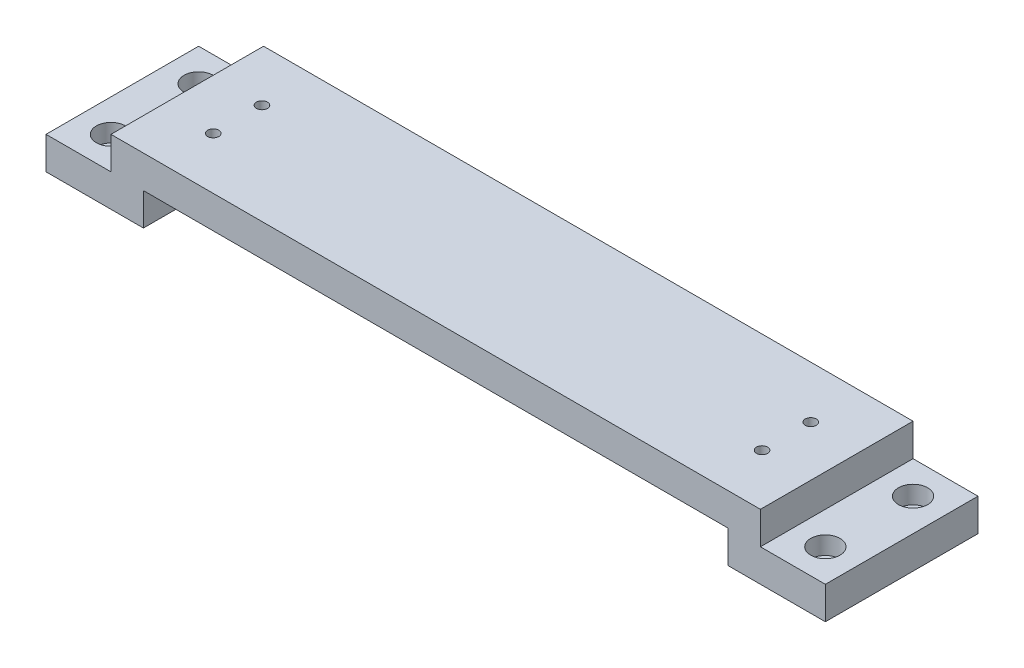
ISO-10303-21;
HEADER;
FILE_DESCRIPTION(('STEP AP214'),'2;1');
FILE_NAME('part.step','',(''),(''),'','','');
FILE_SCHEMA(('AUTOMOTIVE_DESIGN { 1 0 10303 214 1 1 1 1 }'));
ENDSEC;
DATA;
#1=APPLICATION_CONTEXT('core data for automotive mechanical design processes');
#2=APPLICATION_PROTOCOL_DEFINITION('international standard','automotive_design',2000,#1);
#3=PRODUCT_CONTEXT('',#1,'mechanical');
#4=PRODUCT('Part','Part','',(#3));
#5=PRODUCT_RELATED_PRODUCT_CATEGORY('part','',(#4));
#6=PRODUCT_DEFINITION_FORMATION('','',#4);
#7=PRODUCT_DEFINITION_CONTEXT('part definition',#1,'design');
#8=PRODUCT_DEFINITION('design','',#6,#7);
#9=PRODUCT_DEFINITION_SHAPE('','',#8);
#10=(LENGTH_UNIT() NAMED_UNIT(*) SI_UNIT(.MILLI.,.METRE.));
#11=(NAMED_UNIT(*) PLANE_ANGLE_UNIT() SI_UNIT($,.RADIAN.));
#12=(NAMED_UNIT(*) SI_UNIT($,.STERADIAN.) SOLID_ANGLE_UNIT());
#13=UNCERTAINTY_MEASURE_WITH_UNIT(LENGTH_MEASURE(1.E-05),#10,'distance_accuracy_value','');
#14=(GEOMETRIC_REPRESENTATION_CONTEXT(3) GLOBAL_UNCERTAINTY_ASSIGNED_CONTEXT((#13)) GLOBAL_UNIT_ASSIGNED_CONTEXT((#10,
#11,#12)) REPRESENTATION_CONTEXT('',''));
#15=CARTESIAN_POINT('',(0.,0.,0.));
#16=DIRECTION('',(0.,0.,1.));
#17=DIRECTION('',(1.,0.,0.));
#18=AXIS2_PLACEMENT_3D('',#15,#16,#17);
#19=CARTESIAN_POINT('',(-214.5,-11.,-27.));
#20=DIRECTION('',(0.,-1.,0.));
#21=DIRECTION('',(0.,0.,-1.));
#22=AXIS2_PLACEMENT_3D('',#19,#20,#21);
#23=PLANE('',#22);
#24=CARTESIAN_POINT('',(-220.,-11.,-27.));
#25=DIRECTION('',(0.,1.,0.));
#26=DIRECTION('',(0.,0.,1.));
#27=AXIS2_PLACEMENT_3D('',#24,#25,#26);
#28=CIRCLE('',#27,5.5);
#29=CARTESIAN_POINT('',(-220.,-11.,-21.5));
#30=VERTEX_POINT('',#29);
#31=EDGE_CURVE('E269',#30,#30,#28,.T.);
#32=ORIENTED_EDGE('',*,*,#31,.F.);
#33=EDGE_LOOP('',(#32));
#34=FACE_BOUND('',#33,.T.);
#35=CARTESIAN_POINT('',(-220.,-11.,-27.));
#36=DIRECTION('',(0.,1.,0.));
#37=DIRECTION('',(0.,0.,1.));
#38=AXIS2_PLACEMENT_3D('',#35,#36,#37);
#39=CIRCLE('',#38,9.);
#40=CARTESIAN_POINT('',(-220.,-11.,-18.));
#41=VERTEX_POINT('',#40);
#42=EDGE_CURVE('E190',#41,#41,#39,.T.);
#43=ORIENTED_EDGE('',*,*,#42,.T.);
#44=EDGE_LOOP('',(#43));
#45=FACE_BOUND('',#44,.T.);
#46=ADVANCED_FACE('F19',(#34,#45),#23,.F.);
#47=CARTESIAN_POINT('',(-214.5,-11.,27.));
#48=DIRECTION('',(0.,-1.,0.));
#49=DIRECTION('',(0.,0.,-1.));
#50=AXIS2_PLACEMENT_3D('',#47,#48,#49);
#51=PLANE('',#50);
#52=CARTESIAN_POINT('',(-220.,-11.,27.));
#53=DIRECTION('',(0.,1.,0.));
#54=DIRECTION('',(0.,0.,1.));
#55=AXIS2_PLACEMENT_3D('',#52,#53,#54);
#56=CIRCLE('',#55,5.5);
#57=CARTESIAN_POINT('',(-220.,-11.,32.5));
#58=VERTEX_POINT('',#57);
#59=EDGE_CURVE('E251',#58,#58,#56,.T.);
#60=ORIENTED_EDGE('',*,*,#59,.F.);
#61=EDGE_LOOP('',(#60));
#62=FACE_BOUND('',#61,.T.);
#63=CARTESIAN_POINT('',(-220.,-11.,27.));
#64=DIRECTION('',(0.,1.,0.));
#65=DIRECTION('',(0.,0.,1.));
#66=AXIS2_PLACEMENT_3D('',#63,#64,#65);
#67=CIRCLE('',#66,9.);
#68=CARTESIAN_POINT('',(-220.,-11.,36.));
#69=VERTEX_POINT('',#68);
#70=EDGE_CURVE('E394',#69,#69,#67,.T.);
#71=ORIENTED_EDGE('',*,*,#70,.T.);
#72=EDGE_LOOP('',(#71));
#73=FACE_BOUND('',#72,.T.);
#74=ADVANCED_FACE('F453',(#62,#73),#51,.F.);
#75=CARTESIAN_POINT('',(225.5,-11.,-27.));
#76=DIRECTION('',(0.,-1.,0.));
#77=DIRECTION('',(0.,0.,-1.));
#78=AXIS2_PLACEMENT_3D('',#75,#76,#77);
#79=PLANE('',#78);
#80=CARTESIAN_POINT('',(220.,-11.,-27.));
#81=DIRECTION('',(0.,1.,0.));
#82=DIRECTION('',(0.,0.,1.));
#83=AXIS2_PLACEMENT_3D('',#80,#81,#82);
#84=CIRCLE('',#83,5.5);
#85=CARTESIAN_POINT('',(220.,-11.,-21.5));
#86=VERTEX_POINT('',#85);
#87=EDGE_CURVE('E202',#86,#86,#84,.T.);
#88=ORIENTED_EDGE('',*,*,#87,.F.);
#89=EDGE_LOOP('',(#88));
#90=FACE_BOUND('',#89,.T.);
#91=CARTESIAN_POINT('',(220.,-11.,-27.));
#92=DIRECTION('',(0.,1.,0.));
#93=DIRECTION('',(0.,0.,1.));
#94=AXIS2_PLACEMENT_3D('',#91,#92,#93);
#95=CIRCLE('',#94,9.);
#96=CARTESIAN_POINT('',(220.,-11.,-18.));
#97=VERTEX_POINT('',#96);
#98=EDGE_CURVE('E341',#97,#97,#95,.T.);
#99=ORIENTED_EDGE('',*,*,#98,.T.);
#100=EDGE_LOOP('',(#99));
#101=FACE_BOUND('',#100,.T.);
#102=ADVANCED_FACE('F524',(#90,#101),#79,.F.);
#103=CARTESIAN_POINT('',(225.5,-11.,27.));
#104=DIRECTION('',(0.,-1.,0.));
#105=DIRECTION('',(0.,0.,-1.));
#106=AXIS2_PLACEMENT_3D('',#103,#104,#105);
#107=PLANE('',#106);
#108=CARTESIAN_POINT('',(220.,-11.,27.));
#109=DIRECTION('',(0.,1.,0.));
#110=DIRECTION('',(0.,0.,1.));
#111=AXIS2_PLACEMENT_3D('',#108,#109,#110);
#112=CIRCLE('',#111,5.5);
#113=CARTESIAN_POINT('',(220.,-11.,32.5));
#114=VERTEX_POINT('',#113);
#115=EDGE_CURVE('E291',#114,#114,#112,.T.);
#116=ORIENTED_EDGE('',*,*,#115,.F.);
#117=EDGE_LOOP('',(#116));
#118=FACE_BOUND('',#117,.T.);
#119=CARTESIAN_POINT('',(220.,-11.,27.));
#120=DIRECTION('',(0.,1.,0.));
#121=DIRECTION('',(0.,0.,1.));
#122=AXIS2_PLACEMENT_3D('',#119,#120,#121);
#123=CIRCLE('',#122,9.);
#124=CARTESIAN_POINT('',(220.,-11.,36.));
#125=VERTEX_POINT('',#124);
#126=EDGE_CURVE('E207',#125,#125,#123,.T.);
#127=ORIENTED_EDGE('',*,*,#126,.T.);
#128=EDGE_LOOP('',(#127));
#129=FACE_BOUND('',#128,.T.);
#130=ADVANCED_FACE('F525',(#118,#129),#107,.F.);
#131=CARTESIAN_POINT('',(0.,0.,0.));
#132=DIRECTION('',(0.,-1.,0.));
#133=DIRECTION('',(0.,0.,-1.));
#134=AXIS2_PLACEMENT_3D('',#131,#132,#133);
#135=PLANE('',#134);
#136=CARTESIAN_POINT('',(220.,0.,27.));
#137=DIRECTION('',(0.,1.,0.));
#138=DIRECTION('',(0.,0.,1.));
#139=AXIS2_PLACEMENT_3D('',#136,#137,#138);
#140=CIRCLE('',#139,9.);
#141=CARTESIAN_POINT('',(220.,0.,36.));
#142=VERTEX_POINT('',#141);
#143=EDGE_CURVE('E227',#142,#142,#140,.T.);
#144=ORIENTED_EDGE('',*,*,#143,.F.);
#145=EDGE_LOOP('',(#144));
#146=FACE_BOUND('',#145,.T.);
#147=CARTESIAN_POINT('',(220.,0.,-27.));
#148=DIRECTION('',(0.,1.,0.));
#149=DIRECTION('',(0.,0.,1.));
#150=AXIS2_PLACEMENT_3D('',#147,#148,#149);
#151=CIRCLE('',#150,9.);
#152=CARTESIAN_POINT('',(220.,0.,-18.));
#153=VERTEX_POINT('',#152);
#154=EDGE_CURVE('E276',#153,#153,#151,.T.);
#155=ORIENTED_EDGE('',*,*,#154,.F.);
#156=EDGE_LOOP('',(#155));
#157=FACE_BOUND('',#156,.T.);
#158=DIRECTION('',(0.,0.,-1.));
#159=VECTOR('',#158,1.);
#160=CARTESIAN_POINT('',(200.,0.,47.));
#161=LINE('',#160,#159);
#162=CARTESIAN_POINT('',(200.,0.,47.));
#163=VERTEX_POINT('',#162);
#164=CARTESIAN_POINT('',(200.,0.,-47.));
#165=VERTEX_POINT('',#164);
#166=EDGE_CURVE('E311',#163,#165,#161,.T.);
#167=ORIENTED_EDGE('',*,*,#166,.F.);
#168=DIRECTION('',(-1.,0.,0.));
#169=VECTOR('',#168,1.);
#170=CARTESIAN_POINT('',(200.,0.,47.));
#171=LINE('',#170,#169);
#172=CARTESIAN_POINT('',(240.,0.,47.));
#173=VERTEX_POINT('',#172);
#174=EDGE_CURVE('E178',#173,#163,#171,.T.);
#175=ORIENTED_EDGE('',*,*,#174,.F.);
#176=DIRECTION('',(0.,0.,1.));
#177=VECTOR('',#176,1.);
#178=CARTESIAN_POINT('',(240.,0.,47.));
#179=LINE('',#178,#177);
#180=CARTESIAN_POINT('',(240.,0.,-47.));
#181=VERTEX_POINT('',#180);
#182=EDGE_CURVE('E12',#181,#173,#179,.T.);
#183=ORIENTED_EDGE('',*,*,#182,.F.);
#184=DIRECTION('',(1.,0.,0.));
#185=VECTOR('',#184,1.);
#186=CARTESIAN_POINT('',(200.,0.,-47.));
#187=LINE('',#186,#185);
#188=EDGE_CURVE('E229',#165,#181,#187,.T.);
#189=ORIENTED_EDGE('',*,*,#188,.F.);
#190=EDGE_LOOP('',(#167,#175,#183,#189));
#191=FACE_BOUND('',#190,.T.);
#192=ADVANCED_FACE('F478',(#146,#157,#191),#135,.F.);
#193=CARTESIAN_POINT('',(240.,0.,47.));
#194=DIRECTION('',(1.,0.,0.));
#195=DIRECTION('',(0.,1.,0.));
#196=AXIS2_PLACEMENT_3D('',#193,#194,#195);
#197=PLANE('',#196);
#198=DIRECTION('',(0.,0.,1.));
#199=VECTOR('',#198,1.);
#200=CARTESIAN_POINT('',(240.,-20.,47.));
#201=LINE('',#200,#199);
#202=CARTESIAN_POINT('',(240.,-20.,-47.));
#203=VERTEX_POINT('',#202);
#204=CARTESIAN_POINT('',(240.,-20.,47.));
#205=VERTEX_POINT('',#204);
#206=EDGE_CURVE('E155',#203,#205,#201,.T.);
#207=ORIENTED_EDGE('',*,*,#206,.F.);
#208=DIRECTION('',(0.,-1.,0.));
#209=VECTOR('',#208,1.);
#210=CARTESIAN_POINT('',(240.,0.,-47.));
#211=LINE('',#210,#209);
#212=EDGE_CURVE('E1040',#181,#203,#211,.T.);
#213=ORIENTED_EDGE('',*,*,#212,.F.);
#214=ORIENTED_EDGE('',*,*,#182,.T.);
#215=DIRECTION('',(0.,-1.,0.));
#216=VECTOR('',#215,1.);
#217=CARTESIAN_POINT('',(240.,0.,47.));
#218=LINE('',#217,#216);
#219=EDGE_CURVE('E161',#173,#205,#218,.T.);
#220=ORIENTED_EDGE('',*,*,#219,.T.);
#221=EDGE_LOOP('',(#207,#213,#214,#220));
#222=FACE_BOUND('',#221,.T.);
#223=ADVANCED_FACE('F468',(#222),#197,.T.);
#224=CARTESIAN_POINT('',(0.,0.,0.));
#225=DIRECTION('',(0.,1.,0.));
#226=DIRECTION('',(1.,0.,0.));
#227=AXIS2_PLACEMENT_3D('',#224,#225,#226);
#228=PLANE('',#227);
#229=CARTESIAN_POINT('',(-220.,0.,27.));
#230=DIRECTION('',(0.,1.,0.));
#231=DIRECTION('',(0.,0.,1.));
#232=AXIS2_PLACEMENT_3D('',#229,#230,#231);
#233=CIRCLE('',#232,9.);
#234=CARTESIAN_POINT('',(-220.,0.,36.));
#235=VERTEX_POINT('',#234);
#236=EDGE_CURVE('E255',#235,#235,#233,.T.);
#237=ORIENTED_EDGE('',*,*,#236,.F.);
#238=EDGE_LOOP('',(#237));
#239=FACE_BOUND('',#238,.T.);
#240=CARTESIAN_POINT('',(-220.,0.,-27.));
#241=DIRECTION('',(0.,1.,0.));
#242=DIRECTION('',(0.,0.,1.));
#243=AXIS2_PLACEMENT_3D('',#240,#241,#242);
#244=CIRCLE('',#243,9.);
#245=CARTESIAN_POINT('',(-220.,0.,-18.));
#246=VERTEX_POINT('',#245);
#247=EDGE_CURVE('E271',#246,#246,#244,.T.);
#248=ORIENTED_EDGE('',*,*,#247,.F.);
#249=EDGE_LOOP('',(#248));
#250=FACE_BOUND('',#249,.T.);
#251=DIRECTION('',(0.,0.,1.));
#252=VECTOR('',#251,1.);
#253=CARTESIAN_POINT('',(-200.,0.,47.));
#254=LINE('',#253,#252);
#255=CARTESIAN_POINT('',(-200.,0.,-47.));
#256=VERTEX_POINT('',#255);
#257=CARTESIAN_POINT('',(-200.,0.,47.));
#258=VERTEX_POINT('',#257);
#259=EDGE_CURVE('E367',#256,#258,#254,.T.);
#260=ORIENTED_EDGE('',*,*,#259,.F.);
#261=DIRECTION('',(1.,0.,0.));
#262=VECTOR('',#261,1.);
#263=CARTESIAN_POINT('',(-200.,0.,-47.));
#264=LINE('',#263,#262);
#265=CARTESIAN_POINT('',(-240.,0.,-47.));
#266=VERTEX_POINT('',#265);
#267=EDGE_CURVE('E346',#266,#256,#264,.T.);
#268=ORIENTED_EDGE('',*,*,#267,.F.);
#269=DIRECTION('',(0.,0.,-1.));
#270=VECTOR('',#269,1.);
#271=CARTESIAN_POINT('',(-240.,0.,47.));
#272=LINE('',#271,#270);
#273=CARTESIAN_POINT('',(-240.,0.,47.));
#274=VERTEX_POINT('',#273);
#275=EDGE_CURVE('E29',#274,#266,#272,.T.);
#276=ORIENTED_EDGE('',*,*,#275,.F.);
#277=DIRECTION('',(-1.,0.,0.));
#278=VECTOR('',#277,1.);
#279=CARTESIAN_POINT('',(-200.,0.,47.));
#280=LINE('',#279,#278);
#281=EDGE_CURVE('E305',#258,#274,#280,.T.);
#282=ORIENTED_EDGE('',*,*,#281,.F.);
#283=EDGE_LOOP('',(#260,#268,#276,#282));
#284=FACE_BOUND('',#283,.T.);
#285=ADVANCED_FACE('F429',(#239,#250,#284),#228,.T.);
#286=CARTESIAN_POINT('',(-240.,0.,47.));
#287=DIRECTION('',(-1.,0.,0.));
#288=DIRECTION('',(0.,0.,1.));
#289=AXIS2_PLACEMENT_3D('',#286,#287,#288);
#290=PLANE('',#289);
#291=DIRECTION('',(0.,0.,-1.));
#292=VECTOR('',#291,1.);
#293=CARTESIAN_POINT('',(-240.,-20.,47.));
#294=LINE('',#293,#292);
#295=CARTESIAN_POINT('',(-240.,-20.,47.));
#296=VERTEX_POINT('',#295);
#297=CARTESIAN_POINT('',(-240.,-20.,-47.));
#298=VERTEX_POINT('',#297);
#299=EDGE_CURVE('E153',#296,#298,#294,.T.);
#300=ORIENTED_EDGE('',*,*,#299,.F.);
#301=DIRECTION('',(0.,-1.,0.));
#302=VECTOR('',#301,1.);
#303=CARTESIAN_POINT('',(-240.,0.,47.));
#304=LINE('',#303,#302);
#305=EDGE_CURVE('E307',#274,#296,#304,.T.);
#306=ORIENTED_EDGE('',*,*,#305,.F.);
#307=ORIENTED_EDGE('',*,*,#275,.T.);
#308=DIRECTION('',(0.,-1.,0.));
#309=VECTOR('',#308,1.);
#310=CARTESIAN_POINT('',(-240.,0.,-47.));
#311=LINE('',#310,#309);
#312=EDGE_CURVE('E342',#266,#298,#311,.T.);
#313=ORIENTED_EDGE('',*,*,#312,.T.);
#314=EDGE_LOOP('',(#300,#306,#307,#313));
#315=FACE_BOUND('',#314,.T.);
#316=ADVANCED_FACE('F470',(#315),#290,.T.);
#317=CARTESIAN_POINT('',(0.,-20.,0.));
#318=DIRECTION('',(0.,1.,0.));
#319=DIRECTION('',(1.,0.,0.));
#320=AXIS2_PLACEMENT_3D('',#317,#318,#319);
#321=PLANE('',#320);
#322=CARTESIAN_POINT('',(220.,-20.,27.));
#323=DIRECTION('',(0.,1.,0.));
#324=DIRECTION('',(0.,0.,1.));
#325=AXIS2_PLACEMENT_3D('',#322,#323,#324);
#326=CIRCLE('',#325,5.5);
#327=CARTESIAN_POINT('',(220.,-20.,32.5));
#328=VERTEX_POINT('',#327);
#329=EDGE_CURVE('E321',#328,#328,#326,.T.);
#330=ORIENTED_EDGE('',*,*,#329,.T.);
#331=EDGE_LOOP('',(#330));
#332=FACE_BOUND('',#331,.T.);
#333=CARTESIAN_POINT('',(220.,-20.,-27.));
#334=DIRECTION('',(0.,1.,0.));
#335=DIRECTION('',(0.,0.,1.));
#336=AXIS2_PLACEMENT_3D('',#333,#334,#335);
#337=CIRCLE('',#336,5.5);
#338=CARTESIAN_POINT('',(220.,-20.,-21.5));
#339=VERTEX_POINT('',#338);
#340=EDGE_CURVE('E209',#339,#339,#337,.T.);
#341=ORIENTED_EDGE('',*,*,#340,.T.);
#342=EDGE_LOOP('',(#341));
#343=FACE_BOUND('',#342,.T.);
#344=DIRECTION('',(1.,0.,0.));
#345=VECTOR('',#344,1.);
#346=CARTESIAN_POINT('',(200.,-20.,-47.));
#347=LINE('',#346,#345);
#348=CARTESIAN_POINT('',(180.,-20.,-47.));
#349=VERTEX_POINT('',#348);
#350=EDGE_CURVE('E205',#349,#203,#347,.T.);
#351=ORIENTED_EDGE('',*,*,#350,.T.);
#352=ORIENTED_EDGE('',*,*,#206,.T.);
#353=DIRECTION('',(-1.,0.,0.));
#354=VECTOR('',#353,1.);
#355=CARTESIAN_POINT('',(200.,-20.,47.));
#356=LINE('',#355,#354);
#357=CARTESIAN_POINT('',(180.,-20.,47.));
#358=VERTEX_POINT('',#357);
#359=EDGE_CURVE('E156',#205,#358,#356,.T.);
#360=ORIENTED_EDGE('',*,*,#359,.T.);
#361=DIRECTION('',(0.,0.,-1.));
#362=VECTOR('',#361,1.);
#363=CARTESIAN_POINT('',(180.,-20.,47.));
#364=LINE('',#363,#362);
#365=EDGE_CURVE('E139',#358,#349,#364,.T.);
#366=ORIENTED_EDGE('',*,*,#365,.T.);
#367=EDGE_LOOP('',(#351,#352,#360,#366));
#368=FACE_BOUND('',#367,.T.);
#369=ADVANCED_FACE('F160',(#332,#343,#368),#321,.F.);
#370=CARTESIAN_POINT('',(180.,-20.,47.));
#371=DIRECTION('',(1.,0.,0.));
#372=DIRECTION('',(0.,1.,0.));
#373=AXIS2_PLACEMENT_3D('',#370,#371,#372);
#374=PLANE('',#373);
#375=DIRECTION('',(0.,0.,-1.));
#376=VECTOR('',#375,1.);
#377=CARTESIAN_POINT('',(180.,0.,47.));
#378=LINE('',#377,#376);
#379=CARTESIAN_POINT('',(180.,0.,47.));
#380=VERTEX_POINT('',#379);
#381=CARTESIAN_POINT('',(180.,0.,-47.));
#382=VERTEX_POINT('',#381);
#383=EDGE_CURVE('E290',#380,#382,#378,.T.);
#384=ORIENTED_EDGE('',*,*,#383,.T.);
#385=DIRECTION('',(0.,1.,0.));
#386=VECTOR('',#385,1.);
#387=CARTESIAN_POINT('',(180.,-20.,-47.));
#388=LINE('',#387,#386);
#389=EDGE_CURVE('E150',#349,#382,#388,.T.);
#390=ORIENTED_EDGE('',*,*,#389,.F.);
#391=ORIENTED_EDGE('',*,*,#365,.F.);
#392=DIRECTION('',(0.,1.,0.));
#393=VECTOR('',#392,1.);
#394=CARTESIAN_POINT('',(180.,-20.,47.));
#395=LINE('',#394,#393);
#396=EDGE_CURVE('E144',#358,#380,#395,.T.);
#397=ORIENTED_EDGE('',*,*,#396,.T.);
#398=EDGE_LOOP('',(#384,#390,#391,#397));
#399=FACE_BOUND('',#398,.T.);
#400=ADVANCED_FACE('F141',(#399),#374,.F.);
#401=CARTESIAN_POINT('',(0.,-20.,0.));
#402=DIRECTION('',(0.,-1.,0.));
#403=DIRECTION('',(0.,0.,-1.));
#404=AXIS2_PLACEMENT_3D('',#401,#402,#403);
#405=PLANE('',#404);
#406=CARTESIAN_POINT('',(-220.,-20.,27.));
#407=DIRECTION('',(0.,1.,0.));
#408=DIRECTION('',(0.,0.,1.));
#409=AXIS2_PLACEMENT_3D('',#406,#407,#408);
#410=CIRCLE('',#409,5.5);
#411=CARTESIAN_POINT('',(-220.,-20.,32.5));
#412=VERTEX_POINT('',#411);
#413=EDGE_CURVE('E247',#412,#412,#410,.T.);
#414=ORIENTED_EDGE('',*,*,#413,.T.);
#415=EDGE_LOOP('',(#414));
#416=FACE_BOUND('',#415,.T.);
#417=CARTESIAN_POINT('',(-220.,-20.,-27.));
#418=DIRECTION('',(0.,1.,0.));
#419=DIRECTION('',(0.,0.,1.));
#420=AXIS2_PLACEMENT_3D('',#417,#418,#419);
#421=CIRCLE('',#420,5.5);
#422=CARTESIAN_POINT('',(-220.,-20.,-21.5));
#423=VERTEX_POINT('',#422);
#424=EDGE_CURVE('E264',#423,#423,#421,.T.);
#425=ORIENTED_EDGE('',*,*,#424,.T.);
#426=EDGE_LOOP('',(#425));
#427=FACE_BOUND('',#426,.T.);
#428=DIRECTION('',(-1.,0.,0.));
#429=VECTOR('',#428,1.);
#430=CARTESIAN_POINT('',(-200.,-20.,47.));
#431=LINE('',#430,#429);
#432=CARTESIAN_POINT('',(-180.,-20.,47.));
#433=VERTEX_POINT('',#432);
#434=EDGE_CURVE('E173',#433,#296,#431,.T.);
#435=ORIENTED_EDGE('',*,*,#434,.T.);
#436=ORIENTED_EDGE('',*,*,#299,.T.);
#437=DIRECTION('',(1.,0.,0.));
#438=VECTOR('',#437,1.);
#439=CARTESIAN_POINT('',(-200.,-20.,-47.));
#440=LINE('',#439,#438);
#441=CARTESIAN_POINT('',(-180.,-20.,-47.));
#442=VERTEX_POINT('',#441);
#443=EDGE_CURVE('E348',#298,#442,#440,.T.);
#444=ORIENTED_EDGE('',*,*,#443,.T.);
#445=DIRECTION('',(0.,0.,1.));
#446=VECTOR('',#445,1.);
#447=CARTESIAN_POINT('',(-180.,-20.,47.));
#448=LINE('',#447,#446);
#449=EDGE_CURVE('E135',#442,#433,#448,.T.);
#450=ORIENTED_EDGE('',*,*,#449,.T.);
#451=EDGE_LOOP('',(#435,#436,#444,#450));
#452=FACE_BOUND('',#451,.T.);
#453=ADVANCED_FACE('F496',(#416,#427,#452),#405,.T.);
#454=CARTESIAN_POINT('',(-180.,-20.,47.));
#455=DIRECTION('',(-1.,0.,0.));
#456=DIRECTION('',(0.,0.,1.));
#457=AXIS2_PLACEMENT_3D('',#454,#455,#456);
#458=PLANE('',#457);
#459=DIRECTION('',(0.,0.,1.));
#460=VECTOR('',#459,1.);
#461=CARTESIAN_POINT('',(-180.,0.,47.));
#462=LINE('',#461,#460);
#463=CARTESIAN_POINT('',(-180.,0.,-47.));
#464=VERTEX_POINT('',#463);
#465=CARTESIAN_POINT('',(-180.,0.,47.));
#466=VERTEX_POINT('',#465);
#467=EDGE_CURVE('E300',#464,#466,#462,.T.);
#468=ORIENTED_EDGE('',*,*,#467,.T.);
#469=DIRECTION('',(0.,1.,0.));
#470=VECTOR('',#469,1.);
#471=CARTESIAN_POINT('',(-180.,-20.,47.));
#472=LINE('',#471,#470);
#473=EDGE_CURVE('E166',#433,#466,#472,.T.);
#474=ORIENTED_EDGE('',*,*,#473,.F.);
#475=ORIENTED_EDGE('',*,*,#449,.F.);
#476=DIRECTION('',(0.,1.,0.));
#477=VECTOR('',#476,1.);
#478=CARTESIAN_POINT('',(-180.,-20.,-47.));
#479=LINE('',#478,#477);
#480=EDGE_CURVE('E358',#442,#464,#479,.T.);
#481=ORIENTED_EDGE('',*,*,#480,.T.);
#482=EDGE_LOOP('',(#468,#474,#475,#481));
#483=FACE_BOUND('',#482,.T.);
#484=ADVANCED_FACE('F511',(#483),#458,.F.);
#485=CARTESIAN_POINT('',(0.,20.,0.));
#486=DIRECTION('',(0.,-1.,0.));
#487=DIRECTION('',(0.,0.,-1.));
#488=AXIS2_PLACEMENT_3D('',#485,#486,#487);
#489=PLANE('',#488);
#490=CARTESIAN_POINT('',(169.,20.,15.));
#491=DIRECTION('',(0.,1.,0.));
#492=DIRECTION('',(0.,0.,1.));
#493=AXIS2_PLACEMENT_3D('',#490,#491,#492);
#494=CIRCLE('',#493,3.4);
#495=CARTESIAN_POINT('',(169.,20.,18.4));
#496=VERTEX_POINT('',#495);
#497=EDGE_CURVE('E405',#496,#496,#494,.T.);
#498=ORIENTED_EDGE('',*,*,#497,.F.);
#499=EDGE_LOOP('',(#498));
#500=FACE_BOUND('',#499,.T.);
#501=CARTESIAN_POINT('',(169.,20.,-15.));
#502=DIRECTION('',(0.,1.,0.));
#503=DIRECTION('',(0.,0.,1.));
#504=AXIS2_PLACEMENT_3D('',#501,#502,#503);
#505=CIRCLE('',#504,3.4);
#506=CARTESIAN_POINT('',(169.,20.,-11.6));
#507=VERTEX_POINT('',#506);
#508=EDGE_CURVE('E184',#507,#507,#505,.T.);
#509=ORIENTED_EDGE('',*,*,#508,.F.);
#510=EDGE_LOOP('',(#509));
#511=FACE_BOUND('',#510,.T.);
#512=CARTESIAN_POINT('',(-169.,20.,15.));
#513=DIRECTION('',(0.,1.,0.));
#514=DIRECTION('',(0.,0.,1.));
#515=AXIS2_PLACEMENT_3D('',#512,#513,#514);
#516=CIRCLE('',#515,3.4);
#517=CARTESIAN_POINT('',(-169.,20.,18.4));
#518=VERTEX_POINT('',#517);
#519=EDGE_CURVE('E186',#518,#518,#516,.T.);
#520=ORIENTED_EDGE('',*,*,#519,.F.);
#521=EDGE_LOOP('',(#520));
#522=FACE_BOUND('',#521,.T.);
#523=CARTESIAN_POINT('',(-169.,20.,-15.));
#524=DIRECTION('',(0.,1.,0.));
#525=DIRECTION('',(0.,0.,1.));
#526=AXIS2_PLACEMENT_3D('',#523,#524,#525);
#527=CIRCLE('',#526,3.4);
#528=CARTESIAN_POINT('',(-169.,20.,-11.6));
#529=VERTEX_POINT('',#528);
#530=EDGE_CURVE('E203',#529,#529,#527,.T.);
#531=ORIENTED_EDGE('',*,*,#530,.F.);
#532=EDGE_LOOP('',(#531));
#533=FACE_BOUND('',#532,.T.);
#534=DIRECTION('',(0.,0.,-1.));
#535=VECTOR('',#534,1.);
#536=CARTESIAN_POINT('',(200.,20.,47.));
#537=LINE('',#536,#535);
#538=CARTESIAN_POINT('',(200.,20.,47.));
#539=VERTEX_POINT('',#538);
#540=CARTESIAN_POINT('',(200.,20.,-47.));
#541=VERTEX_POINT('',#540);
#542=EDGE_CURVE('E396',#539,#541,#537,.T.);
#543=ORIENTED_EDGE('',*,*,#542,.T.);
#544=DIRECTION('',(-1.,0.,0.));
#545=VECTOR('',#544,1.);
#546=CARTESIAN_POINT('',(-200.,20.,-47.));
#547=LINE('',#546,#545);
#548=CARTESIAN_POINT('',(-200.,20.,-47.));
#549=VERTEX_POINT('',#548);
#550=EDGE_CURVE('E370',#541,#549,#547,.T.);
#551=ORIENTED_EDGE('',*,*,#550,.T.);
#552=DIRECTION('',(0.,0.,1.));
#553=VECTOR('',#552,1.);
#554=CARTESIAN_POINT('',(-200.,20.,47.));
#555=LINE('',#554,#553);
#556=CARTESIAN_POINT('',(-200.,20.,47.));
#557=VERTEX_POINT('',#556);
#558=EDGE_CURVE('E297',#549,#557,#555,.T.);
#559=ORIENTED_EDGE('',*,*,#558,.T.);
#560=DIRECTION('',(1.,0.,0.));
#561=VECTOR('',#560,1.);
#562=CARTESIAN_POINT('',(-200.,20.,47.));
#563=LINE('',#562,#561);
#564=EDGE_CURVE('E382',#557,#539,#563,.T.);
#565=ORIENTED_EDGE('',*,*,#564,.T.);
#566=EDGE_LOOP('',(#543,#551,#559,#565));
#567=FACE_BOUND('',#566,.T.);
#568=ADVANCED_FACE('F507',(#500,#511,#522,#533,#567),#489,.F.);
#569=CARTESIAN_POINT('',(-200.,20.,47.));
#570=DIRECTION('',(0.,0.,-1.));
#571=DIRECTION('',(0.,-1.,0.));
#572=AXIS2_PLACEMENT_3D('',#569,#570,#571);
#573=PLANE('',#572);
#574=DIRECTION('',(0.,-1.,0.));
#575=VECTOR('',#574,1.);
#576=CARTESIAN_POINT('',(-200.,20.,47.));
#577=LINE('',#576,#575);
#578=EDGE_CURVE('E303',#557,#258,#577,.T.);
#579=ORIENTED_EDGE('',*,*,#578,.T.);
#580=ORIENTED_EDGE('',*,*,#281,.T.);
#581=ORIENTED_EDGE('',*,*,#305,.T.);
#582=ORIENTED_EDGE('',*,*,#434,.F.);
#583=ORIENTED_EDGE('',*,*,#473,.T.);
#584=DIRECTION('',(1.,0.,0.));
#585=VECTOR('',#584,1.);
#586=CARTESIAN_POINT('',(-200.,0.,47.));
#587=LINE('',#586,#585);
#588=EDGE_CURVE('E167',#466,#380,#587,.T.);
#589=ORIENTED_EDGE('',*,*,#588,.T.);
#590=ORIENTED_EDGE('',*,*,#396,.F.);
#591=ORIENTED_EDGE('',*,*,#359,.F.);
#592=ORIENTED_EDGE('',*,*,#219,.F.);
#593=ORIENTED_EDGE('',*,*,#174,.T.);
#594=DIRECTION('',(0.,-1.,0.));
#595=VECTOR('',#594,1.);
#596=CARTESIAN_POINT('',(200.,20.,47.));
#597=LINE('',#596,#595);
#598=EDGE_CURVE('E306',#539,#163,#597,.T.);
#599=ORIENTED_EDGE('',*,*,#598,.F.);
#600=ORIENTED_EDGE('',*,*,#564,.F.);
#601=EDGE_LOOP('',(#579,#580,#581,#582,#583,#589,#590,#591,#592,#593,#599,#600));
#602=FACE_BOUND('',#601,.T.);
#603=ADVANCED_FACE('F163',(#602),#573,.F.);
#604=CARTESIAN_POINT('',(-200.,20.,47.));
#605=DIRECTION('',(1.,0.,0.));
#606=DIRECTION('',(0.,1.,0.));
#607=AXIS2_PLACEMENT_3D('',#604,#605,#606);
#608=PLANE('',#607);
#609=DIRECTION('',(0.,-1.,0.));
#610=VECTOR('',#609,1.);
#611=CARTESIAN_POINT('',(-200.,20.,-47.));
#612=LINE('',#611,#610);
#613=EDGE_CURVE('E356',#549,#256,#612,.T.);
#614=ORIENTED_EDGE('',*,*,#613,.T.);
#615=ORIENTED_EDGE('',*,*,#259,.T.);
#616=ORIENTED_EDGE('',*,*,#578,.F.);
#617=ORIENTED_EDGE('',*,*,#558,.F.);
#618=EDGE_LOOP('',(#614,#615,#616,#617));
#619=FACE_BOUND('',#618,.T.);
#620=ADVANCED_FACE('F421',(#619),#608,.F.);
#621=CARTESIAN_POINT('',(-200.,20.,-47.));
#622=DIRECTION('',(0.,0.,1.));
#623=DIRECTION('',(1.,0.,0.));
#624=AXIS2_PLACEMENT_3D('',#621,#622,#623);
#625=PLANE('',#624);
#626=DIRECTION('',(0.,-1.,0.));
#627=VECTOR('',#626,1.);
#628=CARTESIAN_POINT('',(200.,20.,-47.));
#629=LINE('',#628,#627);
#630=EDGE_CURVE('E399',#541,#165,#629,.T.);
#631=ORIENTED_EDGE('',*,*,#630,.T.);
#632=ORIENTED_EDGE('',*,*,#188,.T.);
#633=ORIENTED_EDGE('',*,*,#212,.T.);
#634=ORIENTED_EDGE('',*,*,#350,.F.);
#635=ORIENTED_EDGE('',*,*,#389,.T.);
#636=DIRECTION('',(-1.,0.,0.));
#637=VECTOR('',#636,1.);
#638=CARTESIAN_POINT('',(-200.,0.,-47.));
#639=LINE('',#638,#637);
#640=EDGE_CURVE('E295',#382,#464,#639,.T.);
#641=ORIENTED_EDGE('',*,*,#640,.T.);
#642=ORIENTED_EDGE('',*,*,#480,.F.);
#643=ORIENTED_EDGE('',*,*,#443,.F.);
#644=ORIENTED_EDGE('',*,*,#312,.F.);
#645=ORIENTED_EDGE('',*,*,#267,.T.);
#646=ORIENTED_EDGE('',*,*,#613,.F.);
#647=ORIENTED_EDGE('',*,*,#550,.F.);
#648=EDGE_LOOP('',(#631,#632,#633,#634,#635,#641,#642,#643,#644,#645,#646,#647));
#649=FACE_BOUND('',#648,.T.);
#650=ADVANCED_FACE('F428',(#649),#625,.F.);
#651=CARTESIAN_POINT('',(200.,20.,47.));
#652=DIRECTION('',(-1.,0.,0.));
#653=DIRECTION('',(0.,0.,1.));
#654=AXIS2_PLACEMENT_3D('',#651,#652,#653);
#655=PLANE('',#654);
#656=ORIENTED_EDGE('',*,*,#598,.T.);
#657=ORIENTED_EDGE('',*,*,#166,.T.);
#658=ORIENTED_EDGE('',*,*,#630,.F.);
#659=ORIENTED_EDGE('',*,*,#542,.F.);
#660=EDGE_LOOP('',(#656,#657,#658,#659));
#661=FACE_BOUND('',#660,.T.);
#662=ADVANCED_FACE('F488',(#661),#655,.F.);
#663=CARTESIAN_POINT('',(0.,0.,0.));
#664=DIRECTION('',(0.,-1.,0.));
#665=DIRECTION('',(0.,0.,-1.));
#666=AXIS2_PLACEMENT_3D('',#663,#664,#665);
#667=PLANE('',#666);
#668=CARTESIAN_POINT('',(169.,0.,15.));
#669=DIRECTION('',(0.,-1.,0.));
#670=DIRECTION('',(0.,0.,-1.));
#671=AXIS2_PLACEMENT_3D('',#668,#669,#670);
#672=CIRCLE('',#671,3.4);
#673=CARTESIAN_POINT('',(169.,0.,11.6));
#674=VERTEX_POINT('',#673);
#675=EDGE_CURVE('E211',#674,#674,#672,.T.);
#676=ORIENTED_EDGE('',*,*,#675,.F.);
#677=EDGE_LOOP('',(#676));
#678=FACE_BOUND('',#677,.T.);
#679=CARTESIAN_POINT('',(169.,0.,-15.));
#680=DIRECTION('',(0.,-1.,0.));
#681=DIRECTION('',(0.,0.,-1.));
#682=AXIS2_PLACEMENT_3D('',#679,#680,#681);
#683=CIRCLE('',#682,3.4);
#684=CARTESIAN_POINT('',(169.,0.,-18.4));
#685=VERTEX_POINT('',#684);
#686=EDGE_CURVE('E179',#685,#685,#683,.T.);
#687=ORIENTED_EDGE('',*,*,#686,.F.);
#688=EDGE_LOOP('',(#687));
#689=FACE_BOUND('',#688,.T.);
#690=CARTESIAN_POINT('',(-169.,0.,15.));
#691=DIRECTION('',(0.,-1.,0.));
#692=DIRECTION('',(0.,0.,-1.));
#693=AXIS2_PLACEMENT_3D('',#690,#691,#692);
#694=CIRCLE('',#693,3.4);
#695=CARTESIAN_POINT('',(-169.,0.,11.6));
#696=VERTEX_POINT('',#695);
#697=EDGE_CURVE('E194',#696,#696,#694,.T.);
#698=ORIENTED_EDGE('',*,*,#697,.F.);
#699=EDGE_LOOP('',(#698));
#700=FACE_BOUND('',#699,.T.);
#701=CARTESIAN_POINT('',(-169.,0.,-15.));
#702=DIRECTION('',(0.,-1.,0.));
#703=DIRECTION('',(0.,0.,-1.));
#704=AXIS2_PLACEMENT_3D('',#701,#702,#703);
#705=CIRCLE('',#704,3.4);
#706=CARTESIAN_POINT('',(-169.,0.,-18.4));
#707=VERTEX_POINT('',#706);
#708=EDGE_CURVE('E243',#707,#707,#705,.T.);
#709=ORIENTED_EDGE('',*,*,#708,.F.);
#710=EDGE_LOOP('',(#709));
#711=FACE_BOUND('',#710,.T.);
#712=ORIENTED_EDGE('',*,*,#640,.F.);
#713=ORIENTED_EDGE('',*,*,#383,.F.);
#714=ORIENTED_EDGE('',*,*,#588,.F.);
#715=ORIENTED_EDGE('',*,*,#467,.F.);
#716=EDGE_LOOP('',(#712,#713,#714,#715));
#717=FACE_BOUND('',#716,.T.);
#718=ADVANCED_FACE('F491',(#678,#689,#700,#711,#717),#667,.T.);
#719=CARTESIAN_POINT('',(220.,0.,27.));
#720=DIRECTION('',(0.,1.,0.));
#721=DIRECTION('',(0.,0.,1.));
#722=AXIS2_PLACEMENT_3D('',#719,#720,#721);
#723=CYLINDRICAL_SURFACE('',#722,5.5);
#724=ORIENTED_EDGE('',*,*,#115,.T.);
#725=EDGE_LOOP('',(#724));
#726=FACE_BOUND('',#725,.T.);
#727=ORIENTED_EDGE('',*,*,#329,.F.);
#728=EDGE_LOOP('',(#727));
#729=FACE_BOUND('',#728,.T.);
#730=ADVANCED_FACE('F494',(#726,#729),#723,.F.);
#731=CARTESIAN_POINT('',(220.,0.,27.));
#732=DIRECTION('',(0.,1.,0.));
#733=DIRECTION('',(0.,0.,1.));
#734=AXIS2_PLACEMENT_3D('',#731,#732,#733);
#735=CYLINDRICAL_SURFACE('',#734,9.);
#736=ORIENTED_EDGE('',*,*,#143,.T.);
#737=EDGE_LOOP('',(#736));
#738=FACE_BOUND('',#737,.T.);
#739=ORIENTED_EDGE('',*,*,#126,.F.);
#740=EDGE_LOOP('',(#739));
#741=FACE_BOUND('',#740,.T.);
#742=ADVANCED_FACE('F486',(#738,#741),#735,.F.);
#743=CARTESIAN_POINT('',(220.,0.,-27.));
#744=DIRECTION('',(0.,1.,0.));
#745=DIRECTION('',(0.,0.,1.));
#746=AXIS2_PLACEMENT_3D('',#743,#744,#745);
#747=CYLINDRICAL_SURFACE('',#746,5.5);
#748=ORIENTED_EDGE('',*,*,#87,.T.);
#749=EDGE_LOOP('',(#748));
#750=FACE_BOUND('',#749,.T.);
#751=ORIENTED_EDGE('',*,*,#340,.F.);
#752=EDGE_LOOP('',(#751));
#753=FACE_BOUND('',#752,.T.);
#754=ADVANCED_FACE('F483',(#750,#753),#747,.F.);
#755=CARTESIAN_POINT('',(220.,0.,-27.));
#756=DIRECTION('',(0.,1.,0.));
#757=DIRECTION('',(0.,0.,1.));
#758=AXIS2_PLACEMENT_3D('',#755,#756,#757);
#759=CYLINDRICAL_SURFACE('',#758,9.);
#760=ORIENTED_EDGE('',*,*,#154,.T.);
#761=EDGE_LOOP('',(#760));
#762=FACE_BOUND('',#761,.T.);
#763=ORIENTED_EDGE('',*,*,#98,.F.);
#764=EDGE_LOOP('',(#763));
#765=FACE_BOUND('',#764,.T.);
#766=ADVANCED_FACE('F481',(#762,#765),#759,.F.);
#767=CARTESIAN_POINT('',(-220.,0.,27.));
#768=DIRECTION('',(0.,1.,0.));
#769=DIRECTION('',(0.,0.,1.));
#770=AXIS2_PLACEMENT_3D('',#767,#768,#769);
#771=CYLINDRICAL_SURFACE('',#770,5.5);
#772=ORIENTED_EDGE('',*,*,#59,.T.);
#773=EDGE_LOOP('',(#772));
#774=FACE_BOUND('',#773,.T.);
#775=ORIENTED_EDGE('',*,*,#413,.F.);
#776=EDGE_LOOP('',(#775));
#777=FACE_BOUND('',#776,.T.);
#778=ADVANCED_FACE('F544',(#774,#777),#771,.F.);
#779=CARTESIAN_POINT('',(-220.,0.,27.));
#780=DIRECTION('',(0.,1.,0.));
#781=DIRECTION('',(0.,0.,1.));
#782=AXIS2_PLACEMENT_3D('',#779,#780,#781);
#783=CYLINDRICAL_SURFACE('',#782,9.);
#784=ORIENTED_EDGE('',*,*,#236,.T.);
#785=EDGE_LOOP('',(#784));
#786=FACE_BOUND('',#785,.T.);
#787=ORIENTED_EDGE('',*,*,#70,.F.);
#788=EDGE_LOOP('',(#787));
#789=FACE_BOUND('',#788,.T.);
#790=ADVANCED_FACE('F547',(#786,#789),#783,.F.);
#791=CARTESIAN_POINT('',(-220.,0.,-27.));
#792=DIRECTION('',(0.,1.,0.));
#793=DIRECTION('',(0.,0.,1.));
#794=AXIS2_PLACEMENT_3D('',#791,#792,#793);
#795=CYLINDRICAL_SURFACE('',#794,5.5);
#796=ORIENTED_EDGE('',*,*,#31,.T.);
#797=EDGE_LOOP('',(#796));
#798=FACE_BOUND('',#797,.T.);
#799=ORIENTED_EDGE('',*,*,#424,.F.);
#800=EDGE_LOOP('',(#799));
#801=FACE_BOUND('',#800,.T.);
#802=ADVANCED_FACE('F449',(#798,#801),#795,.F.);
#803=CARTESIAN_POINT('',(-220.,0.,-27.));
#804=DIRECTION('',(0.,1.,0.));
#805=DIRECTION('',(0.,0.,1.));
#806=AXIS2_PLACEMENT_3D('',#803,#804,#805);
#807=CYLINDRICAL_SURFACE('',#806,9.);
#808=ORIENTED_EDGE('',*,*,#247,.T.);
#809=EDGE_LOOP('',(#808));
#810=FACE_BOUND('',#809,.T.);
#811=ORIENTED_EDGE('',*,*,#42,.F.);
#812=EDGE_LOOP('',(#811));
#813=FACE_BOUND('',#812,.T.);
#814=ADVANCED_FACE('F463',(#810,#813),#807,.F.);
#815=CARTESIAN_POINT('',(169.,20.,15.));
#816=DIRECTION('',(0.,1.,0.));
#817=DIRECTION('',(0.,0.,1.));
#818=AXIS2_PLACEMENT_3D('',#815,#816,#817);
#819=CYLINDRICAL_SURFACE('',#818,3.4);
#820=ORIENTED_EDGE('',*,*,#497,.T.);
#821=EDGE_LOOP('',(#820));
#822=FACE_BOUND('',#821,.T.);
#823=ORIENTED_EDGE('',*,*,#675,.T.);
#824=EDGE_LOOP('',(#823));
#825=FACE_BOUND('',#824,.T.);
#826=ADVANCED_FACE('F616',(#822,#825),#819,.F.);
#827=CARTESIAN_POINT('',(169.,20.,-15.));
#828=DIRECTION('',(0.,1.,0.));
#829=DIRECTION('',(0.,0.,1.));
#830=AXIS2_PLACEMENT_3D('',#827,#828,#829);
#831=CYLINDRICAL_SURFACE('',#830,3.4);
#832=ORIENTED_EDGE('',*,*,#508,.T.);
#833=EDGE_LOOP('',(#832));
#834=FACE_BOUND('',#833,.T.);
#835=ORIENTED_EDGE('',*,*,#686,.T.);
#836=EDGE_LOOP('',(#835));
#837=FACE_BOUND('',#836,.T.);
#838=ADVANCED_FACE('F612',(#834,#837),#831,.F.);
#839=CARTESIAN_POINT('',(-169.,20.,15.));
#840=DIRECTION('',(0.,1.,0.));
#841=DIRECTION('',(0.,0.,1.));
#842=AXIS2_PLACEMENT_3D('',#839,#840,#841);
#843=CYLINDRICAL_SURFACE('',#842,3.4);
#844=ORIENTED_EDGE('',*,*,#519,.T.);
#845=EDGE_LOOP('',(#844));
#846=FACE_BOUND('',#845,.T.);
#847=ORIENTED_EDGE('',*,*,#697,.T.);
#848=EDGE_LOOP('',(#847));
#849=FACE_BOUND('',#848,.T.);
#850=ADVANCED_FACE('F597',(#846,#849),#843,.F.);
#851=CARTESIAN_POINT('',(-169.,20.,-15.));
#852=DIRECTION('',(0.,1.,0.));
#853=DIRECTION('',(0.,0.,1.));
#854=AXIS2_PLACEMENT_3D('',#851,#852,#853);
#855=CYLINDRICAL_SURFACE('',#854,3.4);
#856=ORIENTED_EDGE('',*,*,#530,.T.);
#857=EDGE_LOOP('',(#856));
#858=FACE_BOUND('',#857,.T.);
#859=ORIENTED_EDGE('',*,*,#708,.T.);
#860=EDGE_LOOP('',(#859));
#861=FACE_BOUND('',#860,.T.);
#862=ADVANCED_FACE('F594',(#858,#861),#855,.F.);
#863=CLOSED_SHELL('',(#46,#74,#102,#130,#192,#223,#285,#316,#369,#400,#453,#484,#568,#603,#620,
#650,#662,#718,#730,#742,#754,#766,#778,#790,#802,#814,#826,#838,#850,#862));
#864=MANIFOLD_SOLID_BREP('B1',#863);
#865=ADVANCED_BREP_SHAPE_REPRESENTATION('',(#18,#864),#14);
#866=SHAPE_DEFINITION_REPRESENTATION(#9,#865);
ENDSEC;
END-ISO-10303-21;
